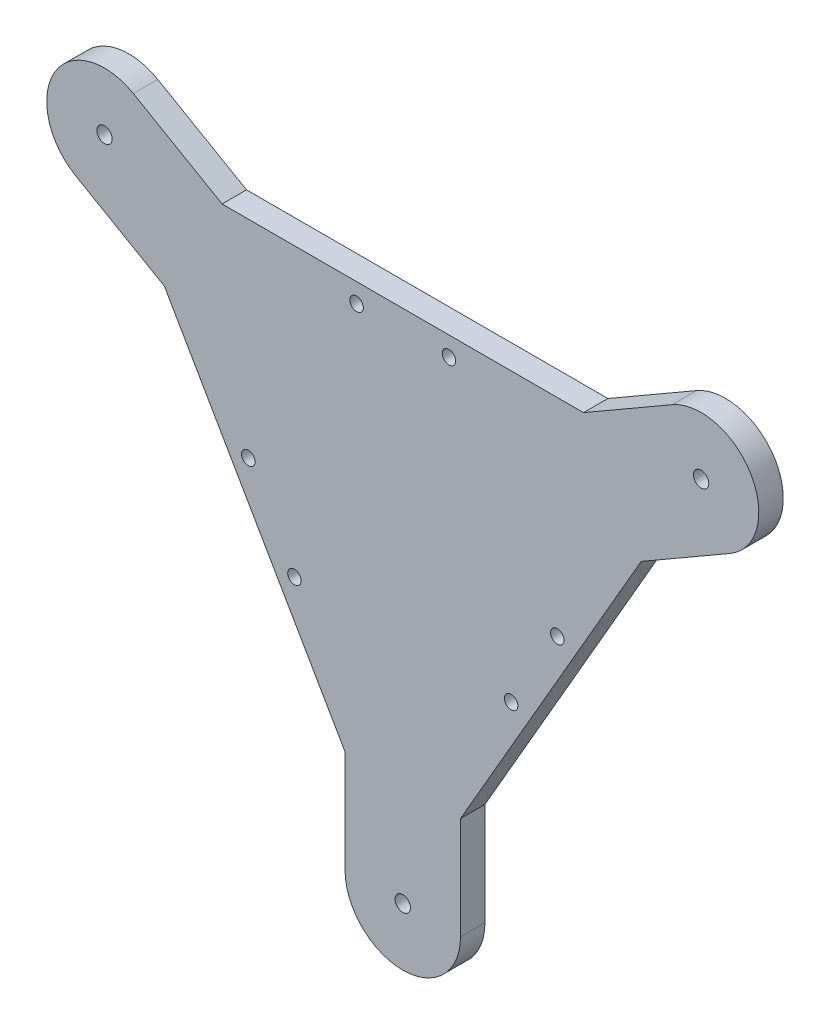
ISO-10303-21;
HEADER;
FILE_DESCRIPTION(('STEP AP214'),'2;1');
FILE_NAME('part.step','',(''),(''),'','','');
FILE_SCHEMA(('AUTOMOTIVE_DESIGN { 1 0 10303 214 1 1 1 1 }'));
ENDSEC;
DATA;
#1=APPLICATION_CONTEXT('core data for automotive mechanical design processes');
#2=APPLICATION_PROTOCOL_DEFINITION('international standard','automotive_design',2000,#1);
#3=PRODUCT_CONTEXT('',#1,'mechanical');
#4=PRODUCT('Part','Part','',(#3));
#5=PRODUCT_RELATED_PRODUCT_CATEGORY('part','',(#4));
#6=PRODUCT_DEFINITION_FORMATION('','',#4);
#7=PRODUCT_DEFINITION_CONTEXT('part definition',#1,'design');
#8=PRODUCT_DEFINITION('design','',#6,#7);
#9=PRODUCT_DEFINITION_SHAPE('','',#8);
#10=(LENGTH_UNIT() NAMED_UNIT(*) SI_UNIT(.MILLI.,.METRE.));
#11=(NAMED_UNIT(*) PLANE_ANGLE_UNIT() SI_UNIT($,.RADIAN.));
#12=(NAMED_UNIT(*) SI_UNIT($,.STERADIAN.) SOLID_ANGLE_UNIT());
#13=UNCERTAINTY_MEASURE_WITH_UNIT(LENGTH_MEASURE(1.E-05),#10,'distance_accuracy_value','');
#14=(GEOMETRIC_REPRESENTATION_CONTEXT(3) GLOBAL_UNCERTAINTY_ASSIGNED_CONTEXT((#13)) GLOBAL_UNIT_ASSIGNED_CONTEXT((#10,
#11,#12)) REPRESENTATION_CONTEXT('',''));
#15=CARTESIAN_POINT('',(0.,0.,0.));
#16=DIRECTION('',(0.,0.,1.));
#17=DIRECTION('',(1.,0.,0.));
#18=AXIS2_PLACEMENT_3D('',#15,#16,#17);
#19=CARTESIAN_POINT('',(0.,0.,6.35));
#20=DIRECTION('',(0.,0.,1.));
#21=DIRECTION('',(1.,0.,0.));
#22=AXIS2_PLACEMENT_3D('',#19,#20,#21);
#23=PLANE('',#22);
#24=CARTESIAN_POINT('',(-77.5000000000001,86.0096458621959,6.35));
#25=DIRECTION('',(0.,0.,1.));
#26=DIRECTION('',(1.,0.,0.));
#27=AXIS2_PLACEMENT_3D('',#24,#25,#26);
#28=CIRCLE('',#27,2.00000000000001);
#29=CARTESIAN_POINT('',(-75.5000000000001,86.0096458621959,6.35));
#30=VERTEX_POINT('',#29);
#31=EDGE_CURVE('E360',#30,#30,#28,.T.);
#32=ORIENTED_EDGE('',*,*,#31,.F.);
#33=EDGE_LOOP('',(#32));
#34=FACE_BOUND('',#33,.T.);
#35=CARTESIAN_POINT('',(77.5,86.009645862196,6.35));
#36=DIRECTION('',(0.,0.,1.));
#37=DIRECTION('',(1.,0.,0.));
#38=AXIS2_PLACEMENT_3D('',#35,#36,#37);
#39=CIRCLE('',#38,2.00000000000001);
#40=CARTESIAN_POINT('',(79.5,86.009645862196,6.35));
#41=VERTEX_POINT('',#40);
#42=EDGE_CURVE('E372',#41,#41,#39,.T.);
#43=ORIENTED_EDGE('',*,*,#42,.F.);
#44=EDGE_LOOP('',(#43));
#45=FACE_BOUND('',#44,.T.);
#46=CARTESIAN_POINT('',(0.,-48.224291724392,6.35));
#47=DIRECTION('',(0.,0.,1.));
#48=DIRECTION('',(1.,0.,0.));
#49=AXIS2_PLACEMENT_3D('',#46,#47,#48);
#50=CIRCLE('',#49,2.);
#51=CARTESIAN_POINT('',(2.,-48.224291724392,6.35));
#52=VERTEX_POINT('',#51);
#53=EDGE_CURVE('E380',#52,#52,#50,.T.);
#54=ORIENTED_EDGE('',*,*,#53,.F.);
#55=EDGE_LOOP('',(#54));
#56=FACE_BOUND('',#55,.T.);
#57=CARTESIAN_POINT('',(-40.1429495554076,31.944863728671,6.35));
#58=DIRECTION('',(0.,0.,1.));
#59=DIRECTION('',(1.,0.,0.));
#60=AXIS2_PLACEMENT_3D('',#57,#58,#59);
#61=CIRCLE('',#60,1.75);
#62=CARTESIAN_POINT('',(-38.3929495554076,31.944863728671,6.35));
#63=VERTEX_POINT('',#62);
#64=EDGE_CURVE('E286',#63,#63,#61,.T.);
#65=ORIENTED_EDGE('',*,*,#64,.F.);
#66=EDGE_LOOP('',(#65));
#67=FACE_BOUND('',#66,.T.);
#68=CARTESIAN_POINT('',(12.,80.6898822334844,6.35));
#69=DIRECTION('',(0.,0.,1.));
#70=DIRECTION('',(1.,0.,0.));
#71=AXIS2_PLACEMENT_3D('',#68,#69,#70);
#72=CIRCLE('',#71,1.75);
#73=CARTESIAN_POINT('',(13.75,80.6898822334844,6.35));
#74=VERTEX_POINT('',#73);
#75=EDGE_CURVE('E275',#74,#74,#72,.T.);
#76=ORIENTED_EDGE('',*,*,#75,.F.);
#77=EDGE_LOOP('',(#76));
#78=FACE_BOUND('',#77,.T.);
#79=CARTESIAN_POINT('',(-12.,80.6898822334844,6.35));
#80=DIRECTION('',(0.,0.,1.));
#81=DIRECTION('',(1.,0.,0.));
#82=AXIS2_PLACEMENT_3D('',#79,#80,#81);
#83=CIRCLE('',#82,1.75);
#84=CARTESIAN_POINT('',(-10.25,80.6898822334844,6.35));
#85=VERTEX_POINT('',#84);
#86=EDGE_CURVE('E295',#85,#85,#83,.T.);
#87=ORIENTED_EDGE('',*,*,#86,.F.);
#88=EDGE_LOOP('',(#87));
#89=FACE_BOUND('',#88,.T.);
#90=CARTESIAN_POINT('',(40.1429495554076,31.944863728671,6.35));
#91=DIRECTION('',(0.,0.,1.));
#92=DIRECTION('',(1.,0.,0.));
#93=AXIS2_PLACEMENT_3D('',#90,#91,#92);
#94=CIRCLE('',#93,1.75);
#95=CARTESIAN_POINT('',(41.8929495554076,31.944863728671,6.35));
#96=VERTEX_POINT('',#95);
#97=EDGE_CURVE('E318',#96,#96,#94,.T.);
#98=ORIENTED_EDGE('',*,*,#97,.F.);
#99=EDGE_LOOP('',(#98));
#100=FACE_BOUND('',#99,.T.);
#101=CARTESIAN_POINT('',(28.1429495554076,11.1602540378445,6.35));
#102=DIRECTION('',(0.,0.,1.));
#103=DIRECTION('',(1.,0.,0.));
#104=AXIS2_PLACEMENT_3D('',#101,#102,#103);
#105=CIRCLE('',#104,1.75);
#106=CARTESIAN_POINT('',(29.8929495554076,11.1602540378445,6.35));
#107=VERTEX_POINT('',#106);
#108=EDGE_CURVE('E310',#107,#107,#105,.T.);
#109=ORIENTED_EDGE('',*,*,#108,.F.);
#110=EDGE_LOOP('',(#109));
#111=FACE_BOUND('',#110,.T.);
#112=CARTESIAN_POINT('',(-28.1429495554076,11.1602540378445,6.35));
#113=DIRECTION('',(0.,0.,1.));
#114=DIRECTION('',(1.,0.,0.));
#115=AXIS2_PLACEMENT_3D('',#112,#113,#114);
#116=CIRCLE('',#115,1.74999999999999);
#117=CARTESIAN_POINT('',(-26.3929495554076,11.1602540378445,6.35));
#118=VERTEX_POINT('',#117);
#119=EDGE_CURVE('E302',#118,#118,#116,.T.);
#120=ORIENTED_EDGE('',*,*,#119,.F.);
#121=EDGE_LOOP('',(#120));
#122=FACE_BOUND('',#121,.T.);
#123=DIRECTION('',(-0.5,0.866025403784439,0.));
#124=VECTOR('',#123,1.);
#125=CARTESIAN_POINT('',(-49.4730765743297,38.1051177665153,6.35));
#126=LINE('',#125,#124);
#127=CARTESIAN_POINT('',(-27.4730765743298,0.,6.35));
#128=VERTEX_POINT('',#127);
#129=CARTESIAN_POINT('',(-49.4730765743297,38.1051177665153,6.34999999999999));
#130=VERTEX_POINT('',#129);
#131=EDGE_CURVE('E49',#128,#130,#126,.T.);
#132=ORIENTED_EDGE('',*,*,#131,.F.);
#133=DIRECTION('',(-0.499999952515138,0.866025431199835,0.));
#134=VECTOR('',#133,1.);
#135=CARTESIAN_POINT('',(-15.,-21.6040050890714,6.34999999999999));
#136=LINE('',#135,#134);
#137=CARTESIAN_POINT('',(-15.,-21.6040050890714,6.34999999999999));
#138=VERTEX_POINT('',#137);
#139=EDGE_CURVE('E181',#138,#128,#136,.T.);
#140=ORIENTED_EDGE('',*,*,#139,.F.);
#141=DIRECTION('',(0.,1.,0.));
#142=VECTOR('',#141,1.);
#143=CARTESIAN_POINT('',(-15.,-48.224291724392,6.34999999999999));
#144=LINE('',#143,#142);
#145=CARTESIAN_POINT('',(-15.,-48.224291724392,6.34999999999999));
#146=VERTEX_POINT('',#145);
#147=EDGE_CURVE('E187',#146,#138,#144,.T.);
#148=ORIENTED_EDGE('',*,*,#147,.F.);
#149=CARTESIAN_POINT('',(0.,-48.224291724392,6.34999999999999));
#150=DIRECTION('',(0.,0.,1.));
#151=DIRECTION('',(1.,0.,0.));
#152=AXIS2_PLACEMENT_3D('',#149,#150,#151);
#153=CIRCLE('',#152,15.);
#154=CARTESIAN_POINT('',(15.,-48.224291724392,6.34999999999999));
#155=VERTEX_POINT('',#154);
#156=EDGE_CURVE('E154',#155,#146,#153,.F.);
#157=ORIENTED_EDGE('',*,*,#156,.F.);
#158=DIRECTION('',(0.,-1.,0.));
#159=VECTOR('',#158,1.);
#160=CARTESIAN_POINT('',(15.,-21.6040050890714,6.34999999999999));
#161=LINE('',#160,#159);
#162=CARTESIAN_POINT('',(15.,-21.6040050890714,6.35000000000002));
#163=VERTEX_POINT('',#162);
#164=EDGE_CURVE('E149',#163,#155,#161,.T.);
#165=ORIENTED_EDGE('',*,*,#164,.F.);
#166=DIRECTION('',(-0.499999952515135,-0.866025431199836,0.));
#167=VECTOR('',#166,1.);
#168=CARTESIAN_POINT('',(27.4730765743297,0.,6.34999999999999));
#169=LINE('',#168,#167);
#170=CARTESIAN_POINT('',(27.4730765743297,0.,6.34999999999999));
#171=VERTEX_POINT('',#170);
#172=EDGE_CURVE('E152',#171,#163,#169,.T.);
#173=ORIENTED_EDGE('',*,*,#172,.F.);
#174=DIRECTION('',(-0.500000000000001,-0.866025403784438,0.));
#175=VECTOR('',#174,1.);
#176=CARTESIAN_POINT('',(27.4730765743297,0.,6.35));
#177=LINE('',#176,#175);
#178=CARTESIAN_POINT('',(61.9461543332241,59.7091221716779,6.34999999999999));
#179=VERTEX_POINT('',#178);
#180=EDGE_CURVE('E170',#179,#171,#177,.T.);
#181=ORIENTED_EDGE('',*,*,#180,.F.);
#182=DIRECTION('',(-0.866025426033726,-0.499999961463103,0.));
#183=VECTOR('',#182,1.);
#184=CARTESIAN_POINT('',(84.9999994077176,73.019264463475,6.34999999999999));
#185=LINE('',#184,#183);
#186=CARTESIAN_POINT('',(84.9999994077176,73.019264463475,6.34999999999999));
#187=VERTEX_POINT('',#186);
#188=EDGE_CURVE('E211',#187,#179,#185,.T.);
#189=ORIENTED_EDGE('',*,*,#188,.F.);
#190=CARTESIAN_POINT('',(77.4999999857709,86.0096458539809,6.34999999999999));
#191=DIRECTION('',(0.,0.,1.));
#192=DIRECTION('',(1.,0.,0.));
#193=AXIS2_PLACEMENT_3D('',#190,#191,#192);
#194=CIRCLE('',#193,15.);
#195=CARTESIAN_POINT('',(69.9999994077176,99.0000265770082,6.34999999999999));
#196=VERTEX_POINT('',#195);
#197=EDGE_CURVE('E217',#196,#187,#194,.F.);
#198=ORIENTED_EDGE('',*,*,#197,.F.);
#199=DIRECTION('',(0.86602538153515,0.500000038536896,0.));
#200=VECTOR('',#199,1.);
#201=CARTESIAN_POINT('',(46.9461555177889,85.6898822334846,6.34999999999999));
#202=LINE('',#201,#200);
#203=CARTESIAN_POINT('',(46.9461555177889,85.6898822334846,6.35000000000002));
#204=VERTEX_POINT('',#203);
#205=EDGE_CURVE('E222',#204,#196,#202,.T.);
#206=ORIENTED_EDGE('',*,*,#205,.F.);
#207=DIRECTION('',(1.,0.,0.));
#208=VECTOR('',#207,1.);
#209=CARTESIAN_POINT('',(-22.0000000000002,85.6898822334844,6.35));
#210=LINE('',#209,#208);
#211=CARTESIAN_POINT('',(-46.9461555177891,85.6898822334844,6.34999999999999));
#212=VERTEX_POINT('',#211);
#213=EDGE_CURVE('E43',#212,#204,#210,.T.);
#214=ORIENTED_EDGE('',*,*,#213,.F.);
#215=DIRECTION('',(0.866025380987477,-0.500000039485493,0.));
#216=VECTOR('',#215,1.);
#217=CARTESIAN_POINT('',(-69.9999993931385,99.0000266022599,6.34999999999999));
#218=LINE('',#217,#216);
#219=CARTESIAN_POINT('',(-69.9999993931385,99.0000266022599,6.34999999999999));
#220=VERTEX_POINT('',#219);
#221=EDGE_CURVE('E257',#220,#212,#218,.T.);
#222=ORIENTED_EDGE('',*,*,#221,.F.);
#223=CARTESIAN_POINT('',(-77.4999999854209,86.0096458874477,6.34999999999999));
#224=DIRECTION('',(0.,0.,1.));
#225=DIRECTION('',(1.,0.,0.));
#226=AXIS2_PLACEMENT_3D('',#223,#224,#225);
#227=CIRCLE('',#226,15.);
#228=CARTESIAN_POINT('',(-85.0000005777033,73.0192651726355,6.34999999999999));
#229=VERTEX_POINT('',#228);
#230=EDGE_CURVE('E263',#229,#220,#227,.F.);
#231=ORIENTED_EDGE('',*,*,#230,.F.);
#232=DIRECTION('',(-0.866025380987479,0.500000039485491,0.));
#233=VECTOR('',#232,1.);
#234=CARTESIAN_POINT('',(-61.9461567023538,59.7091208038601,6.34999999999999));
#235=LINE('',#234,#233);
#236=CARTESIAN_POINT('',(-61.9461567023538,59.7091208038601,6.35000000000002));
#237=VERTEX_POINT('',#236);
#238=EDGE_CURVE('E268',#237,#229,#235,.T.);
#239=ORIENTED_EDGE('',*,*,#238,.F.);
#240=DIRECTION('',(-0.500000094969729,0.866025348953633,0.));
#241=VECTOR('',#240,1.);
#242=CARTESIAN_POINT('',(-49.4730765743297,38.1051177665153,6.34999999999999));
#243=LINE('',#242,#241);
#244=EDGE_CURVE('E241',#130,#237,#243,.T.);
#245=ORIENTED_EDGE('',*,*,#244,.F.);
#246=EDGE_LOOP('',(#132,#140,#148,#157,#165,#173,#181,#189,#198,#206,#214,#222,#231,#239,#245));
#247=FACE_BOUND('',#246,.T.);
#248=ADVANCED_FACE('F39',(#34,#45,#56,#67,#78,#89,#100,#111,#122,#247),#23,.T.);
#249=CARTESIAN_POINT('',(0.,0.,0.));
#250=DIRECTION('',(0.,0.,1.));
#251=DIRECTION('',(1.,0.,0.));
#252=AXIS2_PLACEMENT_3D('',#249,#250,#251);
#253=PLANE('',#252);
#254=CARTESIAN_POINT('',(-77.5000000000001,86.0096458621959,0.));
#255=DIRECTION('',(0.,0.,1.));
#256=DIRECTION('',(1.,0.,0.));
#257=AXIS2_PLACEMENT_3D('',#254,#255,#256);
#258=CIRCLE('',#257,2.00000000000001);
#259=CARTESIAN_POINT('',(-75.5000000000001,86.0096458621959,0.));
#260=VERTEX_POINT('',#259);
#261=EDGE_CURVE('E355',#260,#260,#258,.T.);
#262=ORIENTED_EDGE('',*,*,#261,.T.);
#263=EDGE_LOOP('',(#262));
#264=FACE_BOUND('',#263,.T.);
#265=CARTESIAN_POINT('',(77.5,86.009645862196,0.));
#266=DIRECTION('',(0.,0.,1.));
#267=DIRECTION('',(1.,0.,0.));
#268=AXIS2_PLACEMENT_3D('',#265,#266,#267);
#269=CIRCLE('',#268,2.00000000000001);
#270=CARTESIAN_POINT('',(79.5,86.009645862196,0.));
#271=VERTEX_POINT('',#270);
#272=EDGE_CURVE('E366',#271,#271,#269,.T.);
#273=ORIENTED_EDGE('',*,*,#272,.T.);
#274=EDGE_LOOP('',(#273));
#275=FACE_BOUND('',#274,.T.);
#276=CARTESIAN_POINT('',(0.,-48.224291724392,0.));
#277=DIRECTION('',(0.,0.,1.));
#278=DIRECTION('',(1.,0.,0.));
#279=AXIS2_PLACEMENT_3D('',#276,#277,#278);
#280=CIRCLE('',#279,2.);
#281=CARTESIAN_POINT('',(2.,-48.224291724392,0.));
#282=VERTEX_POINT('',#281);
#283=EDGE_CURVE('E376',#282,#282,#280,.T.);
#284=ORIENTED_EDGE('',*,*,#283,.T.);
#285=EDGE_LOOP('',(#284));
#286=FACE_BOUND('',#285,.T.);
#287=CARTESIAN_POINT('',(-40.1429495554076,31.944863728671,0.));
#288=DIRECTION('',(0.,0.,1.));
#289=DIRECTION('',(1.,0.,0.));
#290=AXIS2_PLACEMENT_3D('',#287,#288,#289);
#291=CIRCLE('',#290,1.75);
#292=CARTESIAN_POINT('',(-38.3929495554076,31.944863728671,0.));
#293=VERTEX_POINT('',#292);
#294=EDGE_CURVE('E282',#293,#293,#291,.T.);
#295=ORIENTED_EDGE('',*,*,#294,.T.);
#296=EDGE_LOOP('',(#295));
#297=FACE_BOUND('',#296,.T.);
#298=CARTESIAN_POINT('',(12.,80.6898822334844,0.));
#299=DIRECTION('',(0.,0.,1.));
#300=DIRECTION('',(1.,0.,0.));
#301=AXIS2_PLACEMENT_3D('',#298,#299,#300);
#302=CIRCLE('',#301,1.75);
#303=CARTESIAN_POINT('',(13.75,80.6898822334844,0.));
#304=VERTEX_POINT('',#303);
#305=EDGE_CURVE('E291',#304,#304,#302,.T.);
#306=ORIENTED_EDGE('',*,*,#305,.T.);
#307=EDGE_LOOP('',(#306));
#308=FACE_BOUND('',#307,.T.);
#309=CARTESIAN_POINT('',(-12.,80.6898822334844,0.));
#310=DIRECTION('',(0.,0.,1.));
#311=DIRECTION('',(1.,0.,0.));
#312=AXIS2_PLACEMENT_3D('',#309,#310,#311);
#313=CIRCLE('',#312,1.75);
#314=CARTESIAN_POINT('',(-10.25,80.6898822334844,0.));
#315=VERTEX_POINT('',#314);
#316=EDGE_CURVE('E322',#315,#315,#313,.T.);
#317=ORIENTED_EDGE('',*,*,#316,.T.);
#318=EDGE_LOOP('',(#317));
#319=FACE_BOUND('',#318,.T.);
#320=CARTESIAN_POINT('',(40.1429495554076,31.944863728671,0.));
#321=DIRECTION('',(0.,0.,1.));
#322=DIRECTION('',(1.,0.,0.));
#323=AXIS2_PLACEMENT_3D('',#320,#321,#322);
#324=CIRCLE('',#323,1.75);
#325=CARTESIAN_POINT('',(41.8929495554076,31.944863728671,0.));
#326=VERTEX_POINT('',#325);
#327=EDGE_CURVE('E314',#326,#326,#324,.T.);
#328=ORIENTED_EDGE('',*,*,#327,.T.);
#329=EDGE_LOOP('',(#328));
#330=FACE_BOUND('',#329,.T.);
#331=CARTESIAN_POINT('',(28.1429495554076,11.1602540378445,0.));
#332=DIRECTION('',(0.,0.,1.));
#333=DIRECTION('',(1.,0.,0.));
#334=AXIS2_PLACEMENT_3D('',#331,#332,#333);
#335=CIRCLE('',#334,1.75);
#336=CARTESIAN_POINT('',(29.8929495554076,11.1602540378445,0.));
#337=VERTEX_POINT('',#336);
#338=EDGE_CURVE('E306',#337,#337,#335,.T.);
#339=ORIENTED_EDGE('',*,*,#338,.T.);
#340=EDGE_LOOP('',(#339));
#341=FACE_BOUND('',#340,.T.);
#342=CARTESIAN_POINT('',(-28.1429495554076,11.1602540378445,0.));
#343=DIRECTION('',(0.,0.,1.));
#344=DIRECTION('',(1.,0.,0.));
#345=AXIS2_PLACEMENT_3D('',#342,#343,#344);
#346=CIRCLE('',#345,1.74999999999999);
#347=CARTESIAN_POINT('',(-26.3929495554076,11.1602540378445,0.));
#348=VERTEX_POINT('',#347);
#349=EDGE_CURVE('E290',#348,#348,#346,.T.);
#350=ORIENTED_EDGE('',*,*,#349,.T.);
#351=EDGE_LOOP('',(#350));
#352=FACE_BOUND('',#351,.T.);
#353=DIRECTION('',(-0.500000000000001,-0.866025403784438,0.));
#354=VECTOR('',#353,1.);
#355=CARTESIAN_POINT('',(27.4730765743297,0.,0.));
#356=LINE('',#355,#354);
#357=CARTESIAN_POINT('',(61.9461543332241,59.7091221716779,0.));
#358=VERTEX_POINT('',#357);
#359=CARTESIAN_POINT('',(27.4730765743297,0.,0.));
#360=VERTEX_POINT('',#359);
#361=EDGE_CURVE('E57',#358,#360,#356,.T.);
#362=ORIENTED_EDGE('',*,*,#361,.T.);
#363=DIRECTION('',(-0.499999952515135,-0.866025431199836,0.));
#364=VECTOR('',#363,1.);
#365=CARTESIAN_POINT('',(27.4730765743297,0.,0.));
#366=LINE('',#365,#364);
#367=CARTESIAN_POINT('',(15.,-21.6040050890714,0.));
#368=VERTEX_POINT('',#367);
#369=EDGE_CURVE('E179',#360,#368,#366,.T.);
#370=ORIENTED_EDGE('',*,*,#369,.T.);
#371=DIRECTION('',(0.,-1.,0.));
#372=VECTOR('',#371,1.);
#373=CARTESIAN_POINT('',(15.,-21.6040050890714,0.));
#374=LINE('',#373,#372);
#375=CARTESIAN_POINT('',(15.,-48.224291724392,0.));
#376=VERTEX_POINT('',#375);
#377=EDGE_CURVE('E164',#368,#376,#374,.T.);
#378=ORIENTED_EDGE('',*,*,#377,.T.);
#379=CARTESIAN_POINT('',(0.,-48.224291724392,0.));
#380=DIRECTION('',(0.,0.,-1.));
#381=DIRECTION('',(-1.,0.,0.));
#382=AXIS2_PLACEMENT_3D('',#379,#380,#381);
#383=CIRCLE('',#382,15.);
#384=CARTESIAN_POINT('',(-15.,-48.224291724392,0.));
#385=VERTEX_POINT('',#384);
#386=EDGE_CURVE('E358',#376,#385,#383,.T.);
#387=ORIENTED_EDGE('',*,*,#386,.T.);
#388=DIRECTION('',(0.,1.,0.));
#389=VECTOR('',#388,1.);
#390=CARTESIAN_POINT('',(-15.,-48.224291724392,0.));
#391=LINE('',#390,#389);
#392=CARTESIAN_POINT('',(-15.,-21.6040050890714,0.));
#393=VERTEX_POINT('',#392);
#394=EDGE_CURVE('E175',#385,#393,#391,.T.);
#395=ORIENTED_EDGE('',*,*,#394,.T.);
#396=DIRECTION('',(-0.499999952515138,0.866025431199835,0.));
#397=VECTOR('',#396,1.);
#398=CARTESIAN_POINT('',(-15.,-21.6040050890714,0.));
#399=LINE('',#398,#397);
#400=CARTESIAN_POINT('',(-27.4730765743298,0.,0.));
#401=VERTEX_POINT('',#400);
#402=EDGE_CURVE('E172',#393,#401,#399,.T.);
#403=ORIENTED_EDGE('',*,*,#402,.T.);
#404=DIRECTION('',(-0.5,0.866025403784439,0.));
#405=VECTOR('',#404,1.);
#406=CARTESIAN_POINT('',(-49.4730765743297,38.1051177665153,0.));
#407=LINE('',#406,#405);
#408=CARTESIAN_POINT('',(-49.4730765743297,38.1051177665153,0.));
#409=VERTEX_POINT('',#408);
#410=EDGE_CURVE('E11',#401,#409,#407,.T.);
#411=ORIENTED_EDGE('',*,*,#410,.T.);
#412=DIRECTION('',(-0.500000094969729,0.866025348953633,0.));
#413=VECTOR('',#412,1.);
#414=CARTESIAN_POINT('',(-49.4730765743297,38.1051177665153,0.));
#415=LINE('',#414,#413);
#416=CARTESIAN_POINT('',(-61.9461567023538,59.7091208038601,0.));
#417=VERTEX_POINT('',#416);
#418=EDGE_CURVE('E229',#409,#417,#415,.T.);
#419=ORIENTED_EDGE('',*,*,#418,.T.);
#420=DIRECTION('',(-0.866025380987479,0.50000003948549,0.));
#421=VECTOR('',#420,1.);
#422=CARTESIAN_POINT('',(-61.9461567023538,59.7091208038601,0.));
#423=LINE('',#422,#421);
#424=CARTESIAN_POINT('',(-85.0000005777033,73.0192651726355,0.));
#425=VERTEX_POINT('',#424);
#426=EDGE_CURVE('E246',#417,#425,#423,.T.);
#427=ORIENTED_EDGE('',*,*,#426,.T.);
#428=CARTESIAN_POINT('',(-77.4999999854209,86.0096458874477,0.));
#429=DIRECTION('',(0.,0.,-1.));
#430=DIRECTION('',(-1.,0.,0.));
#431=AXIS2_PLACEMENT_3D('',#428,#429,#430);
#432=CIRCLE('',#431,15.);
#433=CARTESIAN_POINT('',(-69.9999993931385,99.0000266022599,0.));
#434=VERTEX_POINT('',#433);
#435=EDGE_CURVE('E242',#425,#434,#432,.T.);
#436=ORIENTED_EDGE('',*,*,#435,.T.);
#437=DIRECTION('',(0.866025380987477,-0.500000039485493,0.));
#438=VECTOR('',#437,1.);
#439=CARTESIAN_POINT('',(-69.9999993931385,99.0000266022599,0.));
#440=LINE('',#439,#438);
#441=CARTESIAN_POINT('',(-46.9461555177891,85.6898822334844,0.));
#442=VERTEX_POINT('',#441);
#443=EDGE_CURVE('E237',#434,#442,#440,.T.);
#444=ORIENTED_EDGE('',*,*,#443,.T.);
#445=DIRECTION('',(1.,0.,0.));
#446=VECTOR('',#445,1.);
#447=CARTESIAN_POINT('',(-22.0000000000002,85.6898822334844,0.));
#448=LINE('',#447,#446);
#449=CARTESIAN_POINT('',(46.9461555177889,85.6898822334846,0.));
#450=VERTEX_POINT('',#449);
#451=EDGE_CURVE('E335',#442,#450,#448,.T.);
#452=ORIENTED_EDGE('',*,*,#451,.T.);
#453=DIRECTION('',(0.86602538153515,0.500000038536896,0.));
#454=VECTOR('',#453,1.);
#455=CARTESIAN_POINT('',(46.9461555177889,85.6898822334846,0.));
#456=LINE('',#455,#454);
#457=CARTESIAN_POINT('',(69.9999994077176,99.0000265770082,0.));
#458=VERTEX_POINT('',#457);
#459=EDGE_CURVE('E185',#450,#458,#456,.T.);
#460=ORIENTED_EDGE('',*,*,#459,.T.);
#461=CARTESIAN_POINT('',(77.4999999857709,86.0096458539809,0.));
#462=DIRECTION('',(0.,0.,-1.));
#463=DIRECTION('',(-1.,0.,0.));
#464=AXIS2_PLACEMENT_3D('',#461,#462,#463);
#465=CIRCLE('',#464,15.);
#466=CARTESIAN_POINT('',(84.9999994077176,73.019264463475,0.));
#467=VERTEX_POINT('',#466);
#468=EDGE_CURVE('E204',#458,#467,#465,.T.);
#469=ORIENTED_EDGE('',*,*,#468,.T.);
#470=DIRECTION('',(-0.866025426033726,-0.499999961463103,0.));
#471=VECTOR('',#470,1.);
#472=CARTESIAN_POINT('',(84.9999994077176,73.019264463475,0.));
#473=LINE('',#472,#471);
#474=EDGE_CURVE('E200',#467,#358,#473,.T.);
#475=ORIENTED_EDGE('',*,*,#474,.T.);
#476=EDGE_LOOP('',(#362,#370,#378,#387,#395,#403,#411,#419,#427,#436,#444,#452,#460,#469,#475));
#477=FACE_BOUND('',#476,.T.);
#478=ADVANCED_FACE('F41',(#264,#275,#286,#297,#308,#319,#330,#341,#352,#477),#253,.F.);
#479=CARTESIAN_POINT('',(-22.0000000000002,85.6898822334844,0.));
#480=DIRECTION('',(0.,-1.,0.));
#481=DIRECTION('',(1.,0.,0.));
#482=AXIS2_PLACEMENT_3D('',#479,#480,#481);
#483=PLANE('',#482);
#484=ORIENTED_EDGE('',*,*,#213,.T.);
#485=DIRECTION('',(0.,0.,-1.));
#486=VECTOR('',#485,1.);
#487=CARTESIAN_POINT('',(46.9461555177889,85.6898822334846,100.834017992788));
#488=LINE('',#487,#486);
#489=EDGE_CURVE('E203',#204,#450,#488,.T.);
#490=ORIENTED_EDGE('',*,*,#489,.T.);
#491=ORIENTED_EDGE('',*,*,#451,.F.);
#492=DIRECTION('',(0.,0.,-1.));
#493=VECTOR('',#492,1.);
#494=CARTESIAN_POINT('',(-46.9461555177891,85.6898822334844,100.834017992788));
#495=LINE('',#494,#493);
#496=EDGE_CURVE('E261',#212,#442,#495,.T.);
#497=ORIENTED_EDGE('',*,*,#496,.F.);
#498=EDGE_LOOP('',(#484,#490,#491,#497));
#499=FACE_BOUND('',#498,.T.);
#500=ADVANCED_FACE('F341',(#499),#483,.F.);
#501=CARTESIAN_POINT('',(27.4730765743297,0.,0.));
#502=DIRECTION('',(-0.866025403784438,0.500000000000001,0.));
#503=DIRECTION('',(-0.500000000000001,-0.866025403784438,0.));
#504=AXIS2_PLACEMENT_3D('',#501,#502,#503);
#505=PLANE('',#504);
#506=ORIENTED_EDGE('',*,*,#180,.T.);
#507=ORIENTED_EDGE('',*,*,#172,.T.);
#508=DIRECTION('',(0.,0.,-1.));
#509=VECTOR('',#508,1.);
#510=CARTESIAN_POINT('',(15.,-21.6040050890714,100.834017992788));
#511=LINE('',#510,#509);
#512=EDGE_CURVE('E159',#163,#368,#511,.T.);
#513=ORIENTED_EDGE('',*,*,#512,.T.);
#514=ORIENTED_EDGE('',*,*,#369,.F.);
#515=ORIENTED_EDGE('',*,*,#361,.F.);
#516=DIRECTION('',(0.,0.,-1.));
#517=VECTOR('',#516,1.);
#518=CARTESIAN_POINT('',(61.9461543332241,59.7091221716779,100.834017992788));
#519=LINE('',#518,#517);
#520=EDGE_CURVE('E215',#179,#358,#519,.T.);
#521=ORIENTED_EDGE('',*,*,#520,.F.);
#522=EDGE_LOOP('',(#506,#507,#513,#514,#515,#521));
#523=FACE_BOUND('',#522,.T.);
#524=ADVANCED_FACE('F168',(#523),#505,.F.);
#525=CARTESIAN_POINT('',(-49.4730765743297,38.1051177665153,0.));
#526=DIRECTION('',(0.866025403784439,0.5,0.));
#527=DIRECTION('',(-0.5,0.866025403784439,0.));
#528=AXIS2_PLACEMENT_3D('',#525,#526,#527);
#529=PLANE('',#528);
#530=ORIENTED_EDGE('',*,*,#131,.T.);
#531=ORIENTED_EDGE('',*,*,#244,.T.);
#532=DIRECTION('',(0.,0.,-1.));
#533=VECTOR('',#532,1.);
#534=CARTESIAN_POINT('',(-61.9461567023538,59.7091208038601,100.834017992788));
#535=LINE('',#534,#533);
#536=EDGE_CURVE('E256',#237,#417,#535,.T.);
#537=ORIENTED_EDGE('',*,*,#536,.T.);
#538=ORIENTED_EDGE('',*,*,#418,.F.);
#539=ORIENTED_EDGE('',*,*,#410,.F.);
#540=ORIENTED_EDGE('',*,*,#402,.F.);
#541=DIRECTION('',(0.,0.,-1.));
#542=VECTOR('',#541,1.);
#543=CARTESIAN_POINT('',(-15.,-21.6040050890714,100.834017992788));
#544=LINE('',#543,#542);
#545=EDGE_CURVE('E186',#138,#393,#544,.T.);
#546=ORIENTED_EDGE('',*,*,#545,.F.);
#547=ORIENTED_EDGE('',*,*,#139,.T.);
#548=EDGE_LOOP('',(#530,#531,#537,#538,#539,#540,#546,#547));
#549=FACE_BOUND('',#548,.T.);
#550=ADVANCED_FACE('F397',(#549),#529,.F.);
#551=CARTESIAN_POINT('',(-28.1429495554076,11.1602540378445,0.));
#552=DIRECTION('',(0.,0.,1.));
#553=DIRECTION('',(1.,0.,0.));
#554=AXIS2_PLACEMENT_3D('',#551,#552,#553);
#555=CYLINDRICAL_SURFACE('',#554,1.74999999999999);
#556=ORIENTED_EDGE('',*,*,#349,.F.);
#557=EDGE_LOOP('',(#556));
#558=FACE_BOUND('',#557,.T.);
#559=ORIENTED_EDGE('',*,*,#119,.T.);
#560=EDGE_LOOP('',(#559));
#561=FACE_BOUND('',#560,.T.);
#562=ADVANCED_FACE('F432',(#558,#561),#555,.F.);
#563=CARTESIAN_POINT('',(28.1429495554076,11.1602540378445,0.));
#564=DIRECTION('',(0.,0.,1.));
#565=DIRECTION('',(1.,0.,0.));
#566=AXIS2_PLACEMENT_3D('',#563,#564,#565);
#567=CYLINDRICAL_SURFACE('',#566,1.75);
#568=ORIENTED_EDGE('',*,*,#338,.F.);
#569=EDGE_LOOP('',(#568));
#570=FACE_BOUND('',#569,.T.);
#571=ORIENTED_EDGE('',*,*,#108,.T.);
#572=EDGE_LOOP('',(#571));
#573=FACE_BOUND('',#572,.T.);
#574=ADVANCED_FACE('F441',(#570,#573),#567,.F.);
#575=CARTESIAN_POINT('',(40.1429495554076,31.944863728671,0.));
#576=DIRECTION('',(0.,0.,1.));
#577=DIRECTION('',(1.,0.,0.));
#578=AXIS2_PLACEMENT_3D('',#575,#576,#577);
#579=CYLINDRICAL_SURFACE('',#578,1.75);
#580=ORIENTED_EDGE('',*,*,#327,.F.);
#581=EDGE_LOOP('',(#580));
#582=FACE_BOUND('',#581,.T.);
#583=ORIENTED_EDGE('',*,*,#97,.T.);
#584=EDGE_LOOP('',(#583));
#585=FACE_BOUND('',#584,.T.);
#586=ADVANCED_FACE('F437',(#582,#585),#579,.F.);
#587=CARTESIAN_POINT('',(-12.,80.6898822334844,0.));
#588=DIRECTION('',(0.,0.,1.));
#589=DIRECTION('',(1.,0.,0.));
#590=AXIS2_PLACEMENT_3D('',#587,#588,#589);
#591=CYLINDRICAL_SURFACE('',#590,1.75);
#592=ORIENTED_EDGE('',*,*,#316,.F.);
#593=EDGE_LOOP('',(#592));
#594=FACE_BOUND('',#593,.T.);
#595=ORIENTED_EDGE('',*,*,#86,.T.);
#596=EDGE_LOOP('',(#595));
#597=FACE_BOUND('',#596,.T.);
#598=ADVANCED_FACE('F433',(#594,#597),#591,.F.);
#599=CARTESIAN_POINT('',(12.,80.6898822334844,0.));
#600=DIRECTION('',(0.,0.,1.));
#601=DIRECTION('',(1.,0.,0.));
#602=AXIS2_PLACEMENT_3D('',#599,#600,#601);
#603=CYLINDRICAL_SURFACE('',#602,1.75);
#604=ORIENTED_EDGE('',*,*,#305,.F.);
#605=EDGE_LOOP('',(#604));
#606=FACE_BOUND('',#605,.T.);
#607=ORIENTED_EDGE('',*,*,#75,.T.);
#608=EDGE_LOOP('',(#607));
#609=FACE_BOUND('',#608,.T.);
#610=ADVANCED_FACE('F436',(#606,#609),#603,.F.);
#611=CARTESIAN_POINT('',(-40.1429495554076,31.944863728671,0.));
#612=DIRECTION('',(0.,0.,1.));
#613=DIRECTION('',(1.,0.,0.));
#614=AXIS2_PLACEMENT_3D('',#611,#612,#613);
#615=CYLINDRICAL_SURFACE('',#614,1.75);
#616=ORIENTED_EDGE('',*,*,#294,.F.);
#617=EDGE_LOOP('',(#616));
#618=FACE_BOUND('',#617,.T.);
#619=ORIENTED_EDGE('',*,*,#64,.T.);
#620=EDGE_LOOP('',(#619));
#621=FACE_BOUND('',#620,.T.);
#622=ADVANCED_FACE('F451',(#618,#621),#615,.F.);
#623=CARTESIAN_POINT('',(-61.9461567023538,59.7091208038601,100.834017992788));
#624=DIRECTION('',(-0.50000003948549,-0.866025380987479,0.));
#625=DIRECTION('',(0.866025380987479,-0.500000039485491,0.));
#626=AXIS2_PLACEMENT_3D('',#623,#624,#625);
#627=PLANE('',#626);
#628=ORIENTED_EDGE('',*,*,#536,.F.);
#629=ORIENTED_EDGE('',*,*,#238,.T.);
#630=DIRECTION('',(0.,0.,-1.));
#631=VECTOR('',#630,1.);
#632=CARTESIAN_POINT('',(-85.0000005777033,73.0192651726355,100.834017992788));
#633=LINE('',#632,#631);
#634=EDGE_CURVE('E267',#229,#425,#633,.T.);
#635=ORIENTED_EDGE('',*,*,#634,.T.);
#636=ORIENTED_EDGE('',*,*,#426,.F.);
#637=EDGE_LOOP('',(#628,#629,#635,#636));
#638=FACE_BOUND('',#637,.T.);
#639=ADVANCED_FACE('F401',(#638),#627,.T.);
#640=CARTESIAN_POINT('',(-77.4999999854209,86.0096458874477,100.834017992788));
#641=DIRECTION('',(0.,0.,-1.));
#642=DIRECTION('',(-1.,0.,0.));
#643=AXIS2_PLACEMENT_3D('',#640,#641,#642);
#644=CYLINDRICAL_SURFACE('',#643,15.);
#645=ORIENTED_EDGE('',*,*,#634,.F.);
#646=ORIENTED_EDGE('',*,*,#230,.T.);
#647=DIRECTION('',(0.,0.,-1.));
#648=VECTOR('',#647,1.);
#649=CARTESIAN_POINT('',(-69.9999993931385,99.0000266022599,100.834017992788));
#650=LINE('',#649,#648);
#651=EDGE_CURVE('E262',#220,#434,#650,.T.);
#652=ORIENTED_EDGE('',*,*,#651,.T.);
#653=ORIENTED_EDGE('',*,*,#435,.F.);
#654=EDGE_LOOP('',(#645,#646,#652,#653));
#655=FACE_BOUND('',#654,.T.);
#656=ADVANCED_FACE('F405',(#655),#644,.T.);
#657=CARTESIAN_POINT('',(-69.9999993931385,99.0000266022599,100.834017992788));
#658=DIRECTION('',(0.500000039485493,0.866025380987477,0.));
#659=DIRECTION('',(-0.866025380987477,0.500000039485493,0.));
#660=AXIS2_PLACEMENT_3D('',#657,#658,#659);
#661=PLANE('',#660);
#662=ORIENTED_EDGE('',*,*,#651,.F.);
#663=ORIENTED_EDGE('',*,*,#221,.T.);
#664=ORIENTED_EDGE('',*,*,#496,.T.);
#665=ORIENTED_EDGE('',*,*,#443,.F.);
#666=EDGE_LOOP('',(#662,#663,#664,#665));
#667=FACE_BOUND('',#666,.T.);
#668=ADVANCED_FACE('F409',(#667),#661,.T.);
#669=CARTESIAN_POINT('',(46.9461555177889,85.6898822334846,100.834017992788));
#670=DIRECTION('',(-0.500000038536896,0.86602538153515,0.));
#671=DIRECTION('',(-0.86602538153515,-0.500000038536896,0.));
#672=AXIS2_PLACEMENT_3D('',#669,#670,#671);
#673=PLANE('',#672);
#674=ORIENTED_EDGE('',*,*,#489,.F.);
#675=ORIENTED_EDGE('',*,*,#205,.T.);
#676=DIRECTION('',(0.,0.,-1.));
#677=VECTOR('',#676,1.);
#678=CARTESIAN_POINT('',(69.9999994077176,99.0000265770082,100.834017992788));
#679=LINE('',#678,#677);
#680=EDGE_CURVE('E221',#196,#458,#679,.T.);
#681=ORIENTED_EDGE('',*,*,#680,.T.);
#682=ORIENTED_EDGE('',*,*,#459,.F.);
#683=EDGE_LOOP('',(#674,#675,#681,#682));
#684=FACE_BOUND('',#683,.T.);
#685=ADVANCED_FACE('F346',(#684),#673,.T.);
#686=CARTESIAN_POINT('',(77.4999999857709,86.0096458539809,100.834017992788));
#687=DIRECTION('',(0.,0.,-1.));
#688=DIRECTION('',(-1.,0.,0.));
#689=AXIS2_PLACEMENT_3D('',#686,#687,#688);
#690=CYLINDRICAL_SURFACE('',#689,15.);
#691=ORIENTED_EDGE('',*,*,#680,.F.);
#692=ORIENTED_EDGE('',*,*,#197,.T.);
#693=DIRECTION('',(0.,0.,-1.));
#694=VECTOR('',#693,1.);
#695=CARTESIAN_POINT('',(84.9999994077176,73.019264463475,100.834017992788));
#696=LINE('',#695,#694);
#697=EDGE_CURVE('E216',#187,#467,#696,.T.);
#698=ORIENTED_EDGE('',*,*,#697,.T.);
#699=ORIENTED_EDGE('',*,*,#468,.F.);
#700=EDGE_LOOP('',(#691,#692,#698,#699));
#701=FACE_BOUND('',#700,.T.);
#702=ADVANCED_FACE('F350',(#701),#690,.T.);
#703=CARTESIAN_POINT('',(84.9999994077176,73.019264463475,100.834017992788));
#704=DIRECTION('',(0.499999961463103,-0.866025426033725,0.));
#705=DIRECTION('',(0.866025426033726,0.499999961463103,0.));
#706=AXIS2_PLACEMENT_3D('',#703,#704,#705);
#707=PLANE('',#706);
#708=ORIENTED_EDGE('',*,*,#697,.F.);
#709=ORIENTED_EDGE('',*,*,#188,.T.);
#710=ORIENTED_EDGE('',*,*,#520,.T.);
#711=ORIENTED_EDGE('',*,*,#474,.F.);
#712=EDGE_LOOP('',(#708,#709,#710,#711));
#713=FACE_BOUND('',#712,.T.);
#714=ADVANCED_FACE('F353',(#713),#707,.T.);
#715=CARTESIAN_POINT('',(15.,-21.6040050890714,100.834017992788));
#716=DIRECTION('',(1.,0.,0.));
#717=DIRECTION('',(0.,0.,-1.));
#718=AXIS2_PLACEMENT_3D('',#715,#716,#717);
#719=PLANE('',#718);
#720=ORIENTED_EDGE('',*,*,#512,.F.);
#721=ORIENTED_EDGE('',*,*,#164,.T.);
#722=DIRECTION('',(0.,0.,-1.));
#723=VECTOR('',#722,1.);
#724=CARTESIAN_POINT('',(15.,-48.224291724392,100.834017992788));
#725=LINE('',#724,#723);
#726=EDGE_CURVE('E158',#155,#376,#725,.T.);
#727=ORIENTED_EDGE('',*,*,#726,.T.);
#728=ORIENTED_EDGE('',*,*,#377,.F.);
#729=EDGE_LOOP('',(#720,#721,#727,#728));
#730=FACE_BOUND('',#729,.T.);
#731=ADVANCED_FACE('F162',(#730),#719,.T.);
#732=CARTESIAN_POINT('',(0.,-48.224291724392,100.834017992788));
#733=DIRECTION('',(0.,0.,-1.));
#734=DIRECTION('',(-1.,0.,0.));
#735=AXIS2_PLACEMENT_3D('',#732,#733,#734);
#736=CYLINDRICAL_SURFACE('',#735,15.);
#737=ORIENTED_EDGE('',*,*,#726,.F.);
#738=ORIENTED_EDGE('',*,*,#156,.T.);
#739=DIRECTION('',(0.,0.,-1.));
#740=VECTOR('',#739,1.);
#741=CARTESIAN_POINT('',(-15.,-48.224291724392,100.834017992788));
#742=LINE('',#741,#740);
#743=EDGE_CURVE('E191',#146,#385,#742,.T.);
#744=ORIENTED_EDGE('',*,*,#743,.T.);
#745=ORIENTED_EDGE('',*,*,#386,.F.);
#746=EDGE_LOOP('',(#737,#738,#744,#745));
#747=FACE_BOUND('',#746,.T.);
#748=ADVANCED_FACE('F392',(#747),#736,.T.);
#749=CARTESIAN_POINT('',(-15.,-48.224291724392,100.834017992788));
#750=DIRECTION('',(-1.,0.,0.));
#751=DIRECTION('',(0.,0.,1.));
#752=AXIS2_PLACEMENT_3D('',#749,#750,#751);
#753=PLANE('',#752);
#754=ORIENTED_EDGE('',*,*,#743,.F.);
#755=ORIENTED_EDGE('',*,*,#147,.T.);
#756=ORIENTED_EDGE('',*,*,#545,.T.);
#757=ORIENTED_EDGE('',*,*,#394,.F.);
#758=EDGE_LOOP('',(#754,#755,#756,#757));
#759=FACE_BOUND('',#758,.T.);
#760=ADVANCED_FACE('F395',(#759),#753,.T.);
#761=CARTESIAN_POINT('',(0.,-48.224291724392,0.));
#762=DIRECTION('',(0.,0.,1.));
#763=DIRECTION('',(1.,0.,0.));
#764=AXIS2_PLACEMENT_3D('',#761,#762,#763);
#765=CYLINDRICAL_SURFACE('',#764,2.);
#766=ORIENTED_EDGE('',*,*,#283,.F.);
#767=EDGE_LOOP('',(#766));
#768=FACE_BOUND('',#767,.T.);
#769=ORIENTED_EDGE('',*,*,#53,.T.);
#770=EDGE_LOOP('',(#769));
#771=FACE_BOUND('',#770,.T.);
#772=ADVANCED_FACE('F516',(#768,#771),#765,.F.);
#773=CARTESIAN_POINT('',(77.5,86.009645862196,0.));
#774=DIRECTION('',(0.,0.,1.));
#775=DIRECTION('',(1.,0.,0.));
#776=AXIS2_PLACEMENT_3D('',#773,#774,#775);
#777=CYLINDRICAL_SURFACE('',#776,2.00000000000001);
#778=ORIENTED_EDGE('',*,*,#272,.F.);
#779=EDGE_LOOP('',(#778));
#780=FACE_BOUND('',#779,.T.);
#781=ORIENTED_EDGE('',*,*,#42,.T.);
#782=EDGE_LOOP('',(#781));
#783=FACE_BOUND('',#782,.T.);
#784=ADVANCED_FACE('F540',(#780,#783),#777,.F.);
#785=CARTESIAN_POINT('',(-77.5000000000001,86.0096458621959,0.));
#786=DIRECTION('',(0.,0.,1.));
#787=DIRECTION('',(1.,0.,0.));
#788=AXIS2_PLACEMENT_3D('',#785,#786,#787);
#789=CYLINDRICAL_SURFACE('',#788,2.00000000000001);
#790=ORIENTED_EDGE('',*,*,#261,.F.);
#791=EDGE_LOOP('',(#790));
#792=FACE_BOUND('',#791,.T.);
#793=ORIENTED_EDGE('',*,*,#31,.T.);
#794=EDGE_LOOP('',(#793));
#795=FACE_BOUND('',#794,.T.);
#796=ADVANCED_FACE('F550',(#792,#795),#789,.F.);
#797=CLOSED_SHELL('',(#248,#478,#500,#524,#550,#562,#574,#586,#598,#610,#622,#639,#656,#668,
#685,#702,#714,#731,#748,#760,#772,#784,#796));
#798=MANIFOLD_SOLID_BREP('B2',#797);
#799=ADVANCED_BREP_SHAPE_REPRESENTATION('',(#18,#798),#14);
#800=SHAPE_DEFINITION_REPRESENTATION(#9,#799);
ENDSEC;
END-ISO-10303-21;
